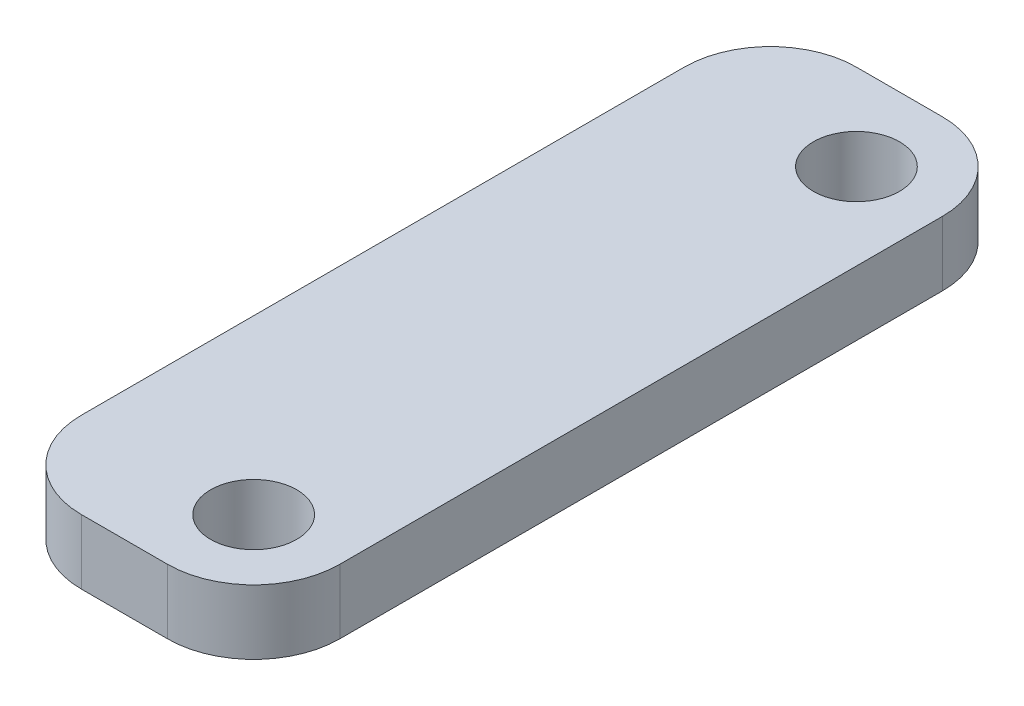
ISO-10303-21;
HEADER;
FILE_DESCRIPTION(('STEP AP214'),'2;1');
FILE_NAME('part.step','',(''),(''),'','','');
FILE_SCHEMA(('AUTOMOTIVE_DESIGN { 1 0 10303 214 1 1 1 1 }'));
ENDSEC;
DATA;
#1=APPLICATION_CONTEXT('core data for automotive mechanical design processes');
#2=APPLICATION_PROTOCOL_DEFINITION('international standard','automotive_design',2000,#1);
#3=PRODUCT_CONTEXT('',#1,'mechanical');
#4=PRODUCT('Part','Part','',(#3));
#5=PRODUCT_RELATED_PRODUCT_CATEGORY('part','',(#4));
#6=PRODUCT_DEFINITION_FORMATION('','',#4);
#7=PRODUCT_DEFINITION_CONTEXT('part definition',#1,'design');
#8=PRODUCT_DEFINITION('design','',#6,#7);
#9=PRODUCT_DEFINITION_SHAPE('','',#8);
#10=(LENGTH_UNIT() NAMED_UNIT(*) SI_UNIT(.MILLI.,.METRE.));
#11=(NAMED_UNIT(*) PLANE_ANGLE_UNIT() SI_UNIT($,.RADIAN.));
#12=(NAMED_UNIT(*) SI_UNIT($,.STERADIAN.) SOLID_ANGLE_UNIT());
#13=UNCERTAINTY_MEASURE_WITH_UNIT(LENGTH_MEASURE(1.E-05),#10,'distance_accuracy_value','');
#14=(GEOMETRIC_REPRESENTATION_CONTEXT(3) GLOBAL_UNCERTAINTY_ASSIGNED_CONTEXT((#13)) GLOBAL_UNIT_ASSIGNED_CONTEXT((#10,
#11,#12)) REPRESENTATION_CONTEXT('',''));
#15=CARTESIAN_POINT('',(0.,0.,0.));
#16=DIRECTION('',(0.,0.,1.));
#17=DIRECTION('',(1.,0.,0.));
#18=AXIS2_PLACEMENT_3D('',#15,#16,#17);
#19=CARTESIAN_POINT('',(0.,1.5,0.));
#20=DIRECTION('',(0.,-1.,0.));
#21=DIRECTION('',(0.,0.,-1.));
#22=AXIS2_PLACEMENT_3D('',#19,#20,#21);
#23=PLANE('',#22);
#24=DIRECTION('',(-1.,0.,0.));
#25=VECTOR('',#24,1.);
#26=CARTESIAN_POINT('',(-6.,1.5,-18.));
#27=LINE('',#26,#25);
#28=CARTESIAN_POINT('',(2.,1.5,-18.));
#29=VERTEX_POINT('',#28);
#30=CARTESIAN_POINT('',(-2.,1.5,-18.));
#31=VERTEX_POINT('',#30);
#32=EDGE_CURVE('E183',#29,#31,#27,.T.);
#33=ORIENTED_EDGE('',*,*,#32,.T.);
#34=CARTESIAN_POINT('',(-2.,1.5,-14.));
#35=DIRECTION('',(0.,-1.,0.));
#36=DIRECTION('',(0.,0.,-1.));
#37=AXIS2_PLACEMENT_3D('',#34,#35,#36);
#38=CIRCLE('',#37,4.);
#39=CARTESIAN_POINT('',(-6.,1.5,-14.));
#40=VERTEX_POINT('',#39);
#41=EDGE_CURVE('E169',#31,#40,#38,.F.);
#42=ORIENTED_EDGE('',*,*,#41,.T.);
#43=DIRECTION('',(0.,0.,1.));
#44=VECTOR('',#43,1.);
#45=CARTESIAN_POINT('',(-6.,1.5,18.));
#46=LINE('',#45,#44);
#47=CARTESIAN_POINT('',(-6.,1.5,14.));
#48=VERTEX_POINT('',#47);
#49=EDGE_CURVE('E126',#40,#48,#46,.T.);
#50=ORIENTED_EDGE('',*,*,#49,.T.);
#51=CARTESIAN_POINT('',(-2.,1.5,14.));
#52=DIRECTION('',(0.,-1.,0.));
#53=DIRECTION('',(0.,0.,-1.));
#54=AXIS2_PLACEMENT_3D('',#51,#52,#53);
#55=CIRCLE('',#54,4.);
#56=CARTESIAN_POINT('',(-2.,1.5,18.));
#57=VERTEX_POINT('',#56);
#58=EDGE_CURVE('E61',#48,#57,#55,.F.);
#59=ORIENTED_EDGE('',*,*,#58,.T.);
#60=DIRECTION('',(1.,0.,0.));
#61=VECTOR('',#60,1.);
#62=CARTESIAN_POINT('',(-6.,1.5,18.));
#63=LINE('',#62,#61);
#64=CARTESIAN_POINT('',(2.,1.5,18.));
#65=VERTEX_POINT('',#64);
#66=EDGE_CURVE('E148',#57,#65,#63,.T.);
#67=ORIENTED_EDGE('',*,*,#66,.T.);
#68=CARTESIAN_POINT('',(2.,1.5,14.));
#69=DIRECTION('',(0.,-1.,0.));
#70=DIRECTION('',(0.,0.,-1.));
#71=AXIS2_PLACEMENT_3D('',#68,#69,#70);
#72=CIRCLE('',#71,4.);
#73=CARTESIAN_POINT('',(6.,1.5,14.));
#74=VERTEX_POINT('',#73);
#75=EDGE_CURVE('E161',#65,#74,#72,.F.);
#76=ORIENTED_EDGE('',*,*,#75,.T.);
#77=DIRECTION('',(0.,0.,-1.));
#78=VECTOR('',#77,1.);
#79=CARTESIAN_POINT('',(6.,1.5,18.));
#80=LINE('',#79,#78);
#81=CARTESIAN_POINT('',(6.,1.5,-14.));
#82=VERTEX_POINT('',#81);
#83=EDGE_CURVE('E141',#74,#82,#80,.T.);
#84=ORIENTED_EDGE('',*,*,#83,.T.);
#85=CARTESIAN_POINT('',(2.,1.5,-14.));
#86=DIRECTION('',(0.,-1.,0.));
#87=DIRECTION('',(0.,0.,-1.));
#88=AXIS2_PLACEMENT_3D('',#85,#86,#87);
#89=CIRCLE('',#88,4.);
#90=EDGE_CURVE('E166',#82,#29,#89,.F.);
#91=ORIENTED_EDGE('',*,*,#90,.T.);
#92=EDGE_LOOP('',(#33,#42,#50,#59,#67,#76,#84,#91));
#93=FACE_BOUND('',#92,.T.);
#94=CARTESIAN_POINT('',(2.,1.5,-14.));
#95=DIRECTION('',(0.,1.,0.));
#96=DIRECTION('',(0.,0.,1.));
#97=AXIS2_PLACEMENT_3D('',#94,#95,#96);
#98=CIRCLE('',#97,2.);
#99=CARTESIAN_POINT('',(2.,1.5,-12.));
#100=VERTEX_POINT('',#99);
#101=EDGE_CURVE('E197',#100,#100,#98,.T.);
#102=ORIENTED_EDGE('',*,*,#101,.F.);
#103=EDGE_LOOP('',(#102));
#104=FACE_BOUND('',#103,.T.);
#105=CARTESIAN_POINT('',(2.,1.5,14.));
#106=DIRECTION('',(0.,1.,0.));
#107=DIRECTION('',(0.,0.,-1.));
#108=AXIS2_PLACEMENT_3D('',#105,#106,#107);
#109=CIRCLE('',#108,2.);
#110=CARTESIAN_POINT('',(2.,1.5,12.));
#111=VERTEX_POINT('',#110);
#112=EDGE_CURVE('E207',#111,#111,#109,.T.);
#113=ORIENTED_EDGE('',*,*,#112,.F.);
#114=EDGE_LOOP('',(#113));
#115=FACE_BOUND('',#114,.T.);
#116=ADVANCED_FACE('F39',(#93,#104,#115),#23,.F.);
#117=CARTESIAN_POINT('',(0.,-1.5,0.));
#118=DIRECTION('',(0.,-1.,0.));
#119=DIRECTION('',(0.,0.,-1.));
#120=AXIS2_PLACEMENT_3D('',#117,#118,#119);
#121=PLANE('',#120);
#122=CARTESIAN_POINT('',(2.,-1.5,-14.));
#123=DIRECTION('',(0.,1.,0.));
#124=DIRECTION('',(0.,0.,1.));
#125=AXIS2_PLACEMENT_3D('',#122,#123,#124);
#126=CIRCLE('',#125,2.);
#127=CARTESIAN_POINT('',(2.,-1.5,-12.));
#128=VERTEX_POINT('',#127);
#129=EDGE_CURVE('E193',#128,#128,#126,.T.);
#130=ORIENTED_EDGE('',*,*,#129,.T.);
#131=EDGE_LOOP('',(#130));
#132=FACE_BOUND('',#131,.T.);
#133=DIRECTION('',(0.,0.,1.));
#134=VECTOR('',#133,1.);
#135=CARTESIAN_POINT('',(-6.,-1.5,18.));
#136=LINE('',#135,#134);
#137=CARTESIAN_POINT('',(-6.,-1.5,-14.));
#138=VERTEX_POINT('',#137);
#139=CARTESIAN_POINT('',(-6.,-1.5,14.));
#140=VERTEX_POINT('',#139);
#141=EDGE_CURVE('E124',#138,#140,#136,.T.);
#142=ORIENTED_EDGE('',*,*,#141,.F.);
#143=CARTESIAN_POINT('',(-2.,-1.5,-14.));
#144=DIRECTION('',(0.,-1.,0.));
#145=DIRECTION('',(0.,0.,-1.));
#146=AXIS2_PLACEMENT_3D('',#143,#144,#145);
#147=CIRCLE('',#146,4.);
#148=CARTESIAN_POINT('',(-2.,-1.5,-18.));
#149=VERTEX_POINT('',#148);
#150=EDGE_CURVE('E106',#138,#149,#147,.T.);
#151=ORIENTED_EDGE('',*,*,#150,.T.);
#152=DIRECTION('',(-1.,0.,0.));
#153=VECTOR('',#152,1.);
#154=CARTESIAN_POINT('',(-6.,-1.5,-18.));
#155=LINE('',#154,#153);
#156=CARTESIAN_POINT('',(2.,-1.5,-18.));
#157=VERTEX_POINT('',#156);
#158=EDGE_CURVE('E137',#157,#149,#155,.T.);
#159=ORIENTED_EDGE('',*,*,#158,.F.);
#160=CARTESIAN_POINT('',(2.,-1.5,-14.));
#161=DIRECTION('',(0.,-1.,0.));
#162=DIRECTION('',(0.,0.,-1.));
#163=AXIS2_PLACEMENT_3D('',#160,#161,#162);
#164=CIRCLE('',#163,4.);
#165=CARTESIAN_POINT('',(6.,-1.5,-14.));
#166=VERTEX_POINT('',#165);
#167=EDGE_CURVE('E118',#157,#166,#164,.T.);
#168=ORIENTED_EDGE('',*,*,#167,.T.);
#169=DIRECTION('',(0.,0.,-1.));
#170=VECTOR('',#169,1.);
#171=CARTESIAN_POINT('',(6.,-1.5,18.));
#172=LINE('',#171,#170);
#173=CARTESIAN_POINT('',(6.,-1.5,14.));
#174=VERTEX_POINT('',#173);
#175=EDGE_CURVE('E143',#174,#166,#172,.T.);
#176=ORIENTED_EDGE('',*,*,#175,.F.);
#177=CARTESIAN_POINT('',(2.,-1.5,14.));
#178=DIRECTION('',(0.,-1.,0.));
#179=DIRECTION('',(0.,0.,-1.));
#180=AXIS2_PLACEMENT_3D('',#177,#178,#179);
#181=CIRCLE('',#180,4.);
#182=CARTESIAN_POINT('',(2.,-1.5,18.));
#183=VERTEX_POINT('',#182);
#184=EDGE_CURVE('E128',#174,#183,#181,.T.);
#185=ORIENTED_EDGE('',*,*,#184,.T.);
#186=DIRECTION('',(1.,0.,0.));
#187=VECTOR('',#186,1.);
#188=CARTESIAN_POINT('',(-6.,-1.5,18.));
#189=LINE('',#188,#187);
#190=CARTESIAN_POINT('',(-2.,-1.5,18.));
#191=VERTEX_POINT('',#190);
#192=EDGE_CURVE('E136',#191,#183,#189,.T.);
#193=ORIENTED_EDGE('',*,*,#192,.F.);
#194=CARTESIAN_POINT('',(-2.,-1.5,14.));
#195=DIRECTION('',(0.,-1.,0.));
#196=DIRECTION('',(0.,0.,-1.));
#197=AXIS2_PLACEMENT_3D('',#194,#195,#196);
#198=CIRCLE('',#197,4.);
#199=EDGE_CURVE('E134',#191,#140,#198,.T.);
#200=ORIENTED_EDGE('',*,*,#199,.T.);
#201=EDGE_LOOP('',(#142,#151,#159,#168,#176,#185,#193,#200));
#202=FACE_BOUND('',#201,.T.);
#203=CARTESIAN_POINT('',(2.,-1.5,14.));
#204=DIRECTION('',(0.,1.,0.));
#205=DIRECTION('',(0.,0.,-1.));
#206=AXIS2_PLACEMENT_3D('',#203,#204,#205);
#207=CIRCLE('',#206,2.);
#208=CARTESIAN_POINT('',(2.,-1.5,12.));
#209=VERTEX_POINT('',#208);
#210=EDGE_CURVE('E209',#209,#209,#207,.T.);
#211=ORIENTED_EDGE('',*,*,#210,.T.);
#212=EDGE_LOOP('',(#211));
#213=FACE_BOUND('',#212,.T.);
#214=ADVANCED_FACE('F131',(#132,#202,#213),#121,.T.);
#215=CARTESIAN_POINT('',(6.,1.5,18.));
#216=DIRECTION('',(-1.,0.,0.));
#217=DIRECTION('',(0.,0.,1.));
#218=AXIS2_PLACEMENT_3D('',#215,#216,#217);
#219=PLANE('',#218);
#220=ORIENTED_EDGE('',*,*,#175,.T.);
#221=DIRECTION('',(0.,-1.,0.));
#222=VECTOR('',#221,1.);
#223=CARTESIAN_POINT('',(6.,1.5,-14.));
#224=LINE('',#223,#222);
#225=EDGE_CURVE('E176',#166,#82,#224,.F.);
#226=ORIENTED_EDGE('',*,*,#225,.T.);
#227=ORIENTED_EDGE('',*,*,#83,.F.);
#228=DIRECTION('',(0.,-1.,0.));
#229=VECTOR('',#228,1.);
#230=CARTESIAN_POINT('',(6.,1.5,14.));
#231=LINE('',#230,#229);
#232=EDGE_CURVE('E172',#74,#174,#231,.T.);
#233=ORIENTED_EDGE('',*,*,#232,.T.);
#234=EDGE_LOOP('',(#220,#226,#227,#233));
#235=FACE_BOUND('',#234,.T.);
#236=ADVANCED_FACE('F225',(#235),#219,.F.);
#237=CARTESIAN_POINT('',(-6.,1.5,-18.));
#238=DIRECTION('',(0.,0.,1.));
#239=DIRECTION('',(1.,0.,0.));
#240=AXIS2_PLACEMENT_3D('',#237,#238,#239);
#241=PLANE('',#240);
#242=ORIENTED_EDGE('',*,*,#158,.T.);
#243=DIRECTION('',(0.,-1.,0.));
#244=VECTOR('',#243,1.);
#245=CARTESIAN_POINT('',(-2.,1.5,-18.));
#246=LINE('',#245,#244);
#247=EDGE_CURVE('E111',#149,#31,#246,.F.);
#248=ORIENTED_EDGE('',*,*,#247,.T.);
#249=ORIENTED_EDGE('',*,*,#32,.F.);
#250=DIRECTION('',(0.,-1.,0.));
#251=VECTOR('',#250,1.);
#252=CARTESIAN_POINT('',(2.,1.5,-18.));
#253=LINE('',#252,#251);
#254=EDGE_CURVE('E117',#29,#157,#253,.T.);
#255=ORIENTED_EDGE('',*,*,#254,.T.);
#256=EDGE_LOOP('',(#242,#248,#249,#255));
#257=FACE_BOUND('',#256,.T.);
#258=ADVANCED_FACE('F238',(#257),#241,.F.);
#259=CARTESIAN_POINT('',(-6.,1.5,18.));
#260=DIRECTION('',(1.,0.,0.));
#261=DIRECTION('',(0.,0.,-1.));
#262=AXIS2_PLACEMENT_3D('',#259,#260,#261);
#263=PLANE('',#262);
#264=ORIENTED_EDGE('',*,*,#49,.F.);
#265=DIRECTION('',(0.,-1.,0.));
#266=VECTOR('',#265,1.);
#267=CARTESIAN_POINT('',(-6.,1.5,-14.));
#268=LINE('',#267,#266);
#269=EDGE_CURVE('E110',#40,#138,#268,.T.);
#270=ORIENTED_EDGE('',*,*,#269,.T.);
#271=ORIENTED_EDGE('',*,*,#141,.T.);
#272=DIRECTION('',(0.,-1.,0.));
#273=VECTOR('',#272,1.);
#274=CARTESIAN_POINT('',(-6.,1.5,14.));
#275=LINE('',#274,#273);
#276=EDGE_CURVE('E129',#140,#48,#275,.F.);
#277=ORIENTED_EDGE('',*,*,#276,.T.);
#278=EDGE_LOOP('',(#264,#270,#271,#277));
#279=FACE_BOUND('',#278,.T.);
#280=ADVANCED_FACE('F123',(#279),#263,.F.);
#281=CARTESIAN_POINT('',(-6.,1.5,18.));
#282=DIRECTION('',(0.,0.,-1.));
#283=DIRECTION('',(-1.,0.,0.));
#284=AXIS2_PLACEMENT_3D('',#281,#282,#283);
#285=PLANE('',#284);
#286=ORIENTED_EDGE('',*,*,#66,.F.);
#287=DIRECTION('',(0.,-1.,0.));
#288=VECTOR('',#287,1.);
#289=CARTESIAN_POINT('',(-2.,1.5,18.));
#290=LINE('',#289,#288);
#291=EDGE_CURVE('E11',#57,#191,#290,.T.);
#292=ORIENTED_EDGE('',*,*,#291,.T.);
#293=ORIENTED_EDGE('',*,*,#192,.T.);
#294=DIRECTION('',(0.,-1.,0.));
#295=VECTOR('',#294,1.);
#296=CARTESIAN_POINT('',(2.,1.5,18.));
#297=LINE('',#296,#295);
#298=EDGE_CURVE('E48',#183,#65,#297,.F.);
#299=ORIENTED_EDGE('',*,*,#298,.T.);
#300=EDGE_LOOP('',(#286,#292,#293,#299));
#301=FACE_BOUND('',#300,.T.);
#302=ADVANCED_FACE('F233',(#301),#285,.F.);
#303=CARTESIAN_POINT('',(2.,1.5,-14.));
#304=DIRECTION('',(0.,-1.,0.));
#305=DIRECTION('',(0.,0.,-1.));
#306=AXIS2_PLACEMENT_3D('',#303,#304,#305);
#307=CYLINDRICAL_SURFACE('',#306,2.);
#308=ORIENTED_EDGE('',*,*,#101,.T.);
#309=EDGE_LOOP('',(#308));
#310=FACE_BOUND('',#309,.T.);
#311=ORIENTED_EDGE('',*,*,#129,.F.);
#312=EDGE_LOOP('',(#311));
#313=FACE_BOUND('',#312,.T.);
#314=ADVANCED_FACE('F230',(#310,#313),#307,.F.);
#315=CARTESIAN_POINT('',(2.,1.5,14.));
#316=DIRECTION('',(0.,-1.,0.));
#317=DIRECTION('',(0.,0.,-1.));
#318=AXIS2_PLACEMENT_3D('',#315,#316,#317);
#319=CYLINDRICAL_SURFACE('',#318,2.);
#320=ORIENTED_EDGE('',*,*,#112,.T.);
#321=EDGE_LOOP('',(#320));
#322=FACE_BOUND('',#321,.T.);
#323=ORIENTED_EDGE('',*,*,#210,.F.);
#324=EDGE_LOOP('',(#323));
#325=FACE_BOUND('',#324,.T.);
#326=ADVANCED_FACE('F217',(#322,#325),#319,.F.);
#327=CARTESIAN_POINT('',(-2.,1.5,-14.));
#328=DIRECTION('',(0.,-1.,0.));
#329=DIRECTION('',(0.,0.,-1.));
#330=AXIS2_PLACEMENT_3D('',#327,#328,#329);
#331=CYLINDRICAL_SURFACE('',#330,4.);
#332=ORIENTED_EDGE('',*,*,#41,.F.);
#333=ORIENTED_EDGE('',*,*,#247,.F.);
#334=ORIENTED_EDGE('',*,*,#150,.F.);
#335=ORIENTED_EDGE('',*,*,#269,.F.);
#336=EDGE_LOOP('',(#332,#333,#334,#335));
#337=FACE_BOUND('',#336,.T.);
#338=ADVANCED_FACE('F109',(#337),#331,.T.);
#339=CARTESIAN_POINT('',(2.,1.5,-14.));
#340=DIRECTION('',(0.,-1.,0.));
#341=DIRECTION('',(0.,0.,-1.));
#342=AXIS2_PLACEMENT_3D('',#339,#340,#341);
#343=CYLINDRICAL_SURFACE('',#342,4.);
#344=ORIENTED_EDGE('',*,*,#90,.F.);
#345=ORIENTED_EDGE('',*,*,#225,.F.);
#346=ORIENTED_EDGE('',*,*,#167,.F.);
#347=ORIENTED_EDGE('',*,*,#254,.F.);
#348=EDGE_LOOP('',(#344,#345,#346,#347));
#349=FACE_BOUND('',#348,.T.);
#350=ADVANCED_FACE('F246',(#349),#343,.T.);
#351=CARTESIAN_POINT('',(-2.,1.5,14.));
#352=DIRECTION('',(0.,-1.,0.));
#353=DIRECTION('',(0.,0.,-1.));
#354=AXIS2_PLACEMENT_3D('',#351,#352,#353);
#355=CYLINDRICAL_SURFACE('',#354,4.);
#356=ORIENTED_EDGE('',*,*,#58,.F.);
#357=ORIENTED_EDGE('',*,*,#276,.F.);
#358=ORIENTED_EDGE('',*,*,#199,.F.);
#359=ORIENTED_EDGE('',*,*,#291,.F.);
#360=EDGE_LOOP('',(#356,#357,#358,#359));
#361=FACE_BOUND('',#360,.T.);
#362=ADVANCED_FACE('F248',(#361),#355,.T.);
#363=CARTESIAN_POINT('',(2.,1.5,14.));
#364=DIRECTION('',(0.,-1.,0.));
#365=DIRECTION('',(0.,0.,-1.));
#366=AXIS2_PLACEMENT_3D('',#363,#364,#365);
#367=CYLINDRICAL_SURFACE('',#366,4.);
#368=ORIENTED_EDGE('',*,*,#75,.F.);
#369=ORIENTED_EDGE('',*,*,#298,.F.);
#370=ORIENTED_EDGE('',*,*,#184,.F.);
#371=ORIENTED_EDGE('',*,*,#232,.F.);
#372=EDGE_LOOP('',(#368,#369,#370,#371));
#373=FACE_BOUND('',#372,.T.);
#374=ADVANCED_FACE('F41',(#373),#367,.T.);
#375=CLOSED_SHELL('',(#116,#214,#236,#258,#280,#302,#314,#326,#338,#350,#362,#374));
#376=MANIFOLD_SOLID_BREP('B2',#375);
#377=ADVANCED_BREP_SHAPE_REPRESENTATION('',(#18,#376),#14);
#378=SHAPE_DEFINITION_REPRESENTATION(#9,#377);
ENDSEC;
END-ISO-10303-21;
